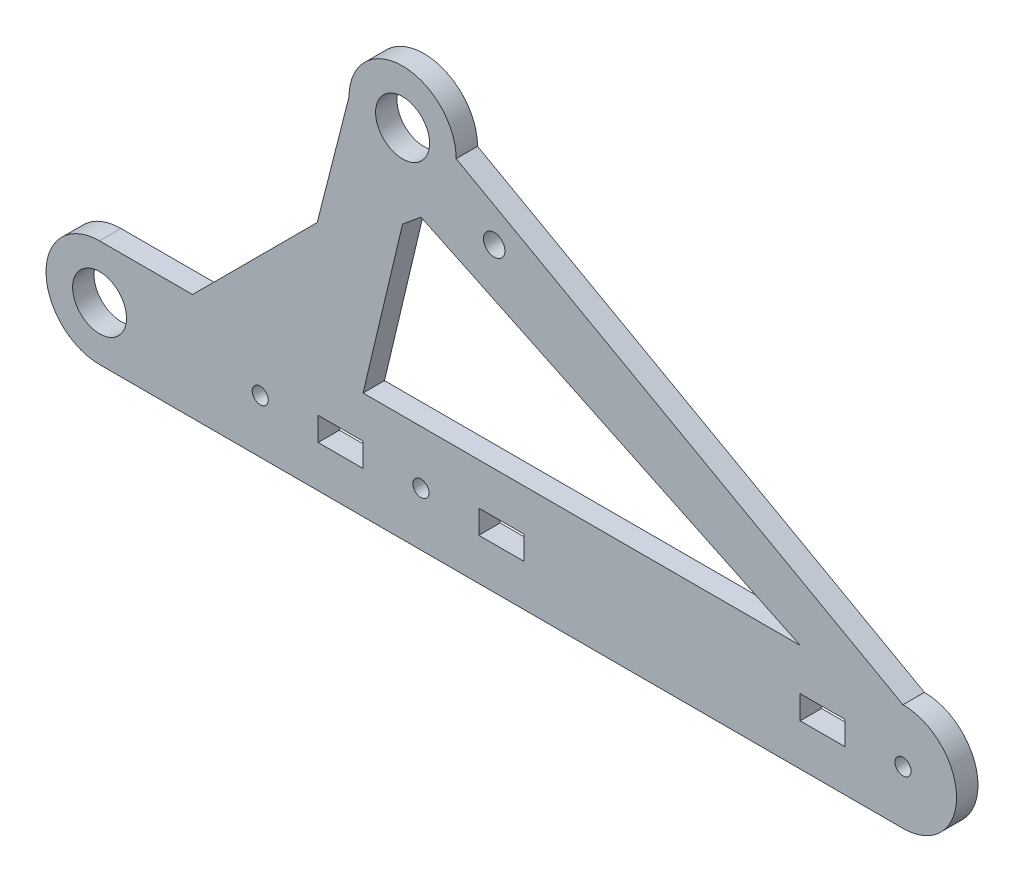
ISO-10303-21;
HEADER;
FILE_DESCRIPTION(('STEP AP214'),'2;1');
FILE_NAME('part.step','',(''),(''),'','','');
FILE_SCHEMA(('AUTOMOTIVE_DESIGN { 1 0 10303 214 1 1 1 1 }'));
ENDSEC;
DATA;
#1=APPLICATION_CONTEXT('core data for automotive mechanical design processes');
#2=APPLICATION_PROTOCOL_DEFINITION('international standard','automotive_design',2000,#1);
#3=PRODUCT_CONTEXT('',#1,'mechanical');
#4=PRODUCT('Part','Part','',(#3));
#5=PRODUCT_RELATED_PRODUCT_CATEGORY('part','',(#4));
#6=PRODUCT_DEFINITION_FORMATION('','',#4);
#7=PRODUCT_DEFINITION_CONTEXT('part definition',#1,'design');
#8=PRODUCT_DEFINITION('design','',#6,#7);
#9=PRODUCT_DEFINITION_SHAPE('','',#8);
#10=(LENGTH_UNIT() NAMED_UNIT(*) SI_UNIT(.MILLI.,.METRE.));
#11=(NAMED_UNIT(*) PLANE_ANGLE_UNIT() SI_UNIT($,.RADIAN.));
#12=(NAMED_UNIT(*) SI_UNIT($,.STERADIAN.) SOLID_ANGLE_UNIT());
#13=UNCERTAINTY_MEASURE_WITH_UNIT(LENGTH_MEASURE(1.E-05),#10,'distance_accuracy_value','');
#14=(GEOMETRIC_REPRESENTATION_CONTEXT(3) GLOBAL_UNCERTAINTY_ASSIGNED_CONTEXT((#13)) GLOBAL_UNIT_ASSIGNED_CONTEXT((#10,
#11,#12)) REPRESENTATION_CONTEXT('',''));
#15=CARTESIAN_POINT('',(0.,0.,0.));
#16=DIRECTION('',(0.,0.,1.));
#17=DIRECTION('',(1.,0.,0.));
#18=AXIS2_PLACEMENT_3D('',#15,#16,#17);
#19=CARTESIAN_POINT('',(150.,0.,4.));
#20=DIRECTION('',(0.,0.,-1.));
#21=DIRECTION('',(-1.,0.,0.));
#22=AXIS2_PLACEMENT_3D('',#19,#20,#21);
#23=PLANE('',#22);
#24=DIRECTION('',(-0.247027018689177,-0.969008592344535,0.));
#25=VECTOR('',#24,1.);
#26=CARTESIAN_POINT('',(34.6966991411009,10.,4.));
#27=LINE('',#26,#25);
#28=CARTESIAN_POINT('',(46.5683051393386,56.5685424949239,4.));
#29=VERTEX_POINT('',#28);
#30=CARTESIAN_POINT('',(40.6325021402197,33.284271247462,4.));
#31=VERTEX_POINT('',#30);
#32=EDGE_CURVE('E293',#29,#31,#27,.T.);
#33=ORIENTED_EDGE('',*,*,#32,.T.);
#34=DIRECTION('',(-0.70710497915049,-0.707108583218013,0.));
#35=VECTOR('',#34,1.);
#36=CARTESIAN_POINT('',(40.6325021402197,33.284271247462,4.));
#37=LINE('',#36,#35);
#38=CARTESIAN_POINT('',(17.3483495705504,10.,4.));
#39=VERTEX_POINT('',#38);
#40=EDGE_CURVE('E55',#31,#39,#37,.T.);
#41=ORIENTED_EDGE('',*,*,#40,.T.);
#42=DIRECTION('',(-1.,0.,0.));
#43=VECTOR('',#42,1.);
#44=CARTESIAN_POINT('',(0.,10.,4.));
#45=LINE('',#44,#43);
#46=CARTESIAN_POINT('',(0.,10.,4.));
#47=VERTEX_POINT('',#46);
#48=EDGE_CURVE('E290',#39,#47,#45,.T.);
#49=ORIENTED_EDGE('',*,*,#48,.T.);
#50=CARTESIAN_POINT('',(0.,0.,4.));
#51=DIRECTION('',(0.,0.,1.));
#52=DIRECTION('',(1.,0.,0.));
#53=AXIS2_PLACEMENT_3D('',#50,#51,#52);
#54=CIRCLE('',#53,10.);
#55=CARTESIAN_POINT('',(0.,-10.,4.));
#56=VERTEX_POINT('',#55);
#57=EDGE_CURVE('E287',#47,#56,#54,.T.);
#58=ORIENTED_EDGE('',*,*,#57,.T.);
#59=DIRECTION('',(1.,0.,0.));
#60=VECTOR('',#59,1.);
#61=CARTESIAN_POINT('',(0.,-10.,4.));
#62=LINE('',#61,#60);
#63=CARTESIAN_POINT('',(150.,-10.,4.));
#64=VERTEX_POINT('',#63);
#65=EDGE_CURVE('E248',#56,#64,#62,.T.);
#66=ORIENTED_EDGE('',*,*,#65,.T.);
#67=CARTESIAN_POINT('',(150.,0.,4.));
#68=DIRECTION('',(0.,0.,1.));
#69=DIRECTION('',(-1.,0.,0.));
#70=AXIS2_PLACEMENT_3D('',#67,#68,#69);
#71=CIRCLE('',#70,10.);
#72=CARTESIAN_POINT('',(150.,10.,4.));
#73=VERTEX_POINT('',#72);
#74=EDGE_CURVE('E242',#64,#73,#71,.T.);
#75=ORIENTED_EDGE('',*,*,#74,.T.);
#76=DIRECTION('',(-0.873187546400361,0.487384354294757,0.));
#77=VECTOR('',#76,1.);
#78=CARTESIAN_POINT('',(66.5687798505088,56.5685424949239,4.));
#79=LINE('',#78,#77);
#80=CARTESIAN_POINT('',(66.5687798505088,56.5685424949239,4.));
#81=VERTEX_POINT('',#80);
#82=EDGE_CURVE('E272',#73,#81,#79,.T.);
#83=ORIENTED_EDGE('',*,*,#82,.T.);
#84=CARTESIAN_POINT('',(56.5685424949237,56.5685424949239,4.));
#85=DIRECTION('',(0.,0.,1.));
#86=DIRECTION('',(-1.,0.,0.));
#87=AXIS2_PLACEMENT_3D('',#84,#85,#86);
#88=CIRCLE('',#87,10.0002373555851);
#89=EDGE_CURVE('E263',#81,#29,#88,.T.);
#90=ORIENTED_EDGE('',*,*,#89,.T.);
#91=EDGE_LOOP('',(#33,#41,#49,#58,#66,#75,#83,#90));
#92=FACE_BOUND('',#91,.T.);
#93=CARTESIAN_POINT('',(73.677090033018,46.2100869567287,4.));
#94=DIRECTION('',(0.,0.,1.));
#95=DIRECTION('',(1.,0.,0.));
#96=AXIS2_PLACEMENT_3D('',#93,#94,#95);
#97=CIRCLE('',#96,2.);
#98=CARTESIAN_POINT('',(75.677090033018,46.2100869567287,4.));
#99=VERTEX_POINT('',#98);
#100=EDGE_CURVE('E455',#99,#99,#97,.T.);
#101=ORIENTED_EDGE('',*,*,#100,.F.);
#102=EDGE_LOOP('',(#101));
#103=FACE_BOUND('',#102,.T.);
#104=DIRECTION('',(0.,1.,0.));
#105=VECTOR('',#104,1.);
#106=CARTESIAN_POINT('',(139.2,2.2,4.));
#107=LINE('',#106,#105);
#108=CARTESIAN_POINT('',(139.2,-2.20000000000001,4.));
#109=VERTEX_POINT('',#108);
#110=CARTESIAN_POINT('',(139.2,2.2,4.));
#111=VERTEX_POINT('',#110);
#112=EDGE_CURVE('E442',#109,#111,#107,.T.);
#113=ORIENTED_EDGE('',*,*,#112,.F.);
#114=DIRECTION('',(1.,0.,0.));
#115=VECTOR('',#114,1.);
#116=CARTESIAN_POINT('',(130.8,-2.20000000000001,4.));
#117=LINE('',#116,#115);
#118=CARTESIAN_POINT('',(130.8,-2.20000000000001,4.));
#119=VERTEX_POINT('',#118);
#120=EDGE_CURVE('E437',#119,#109,#117,.T.);
#121=ORIENTED_EDGE('',*,*,#120,.F.);
#122=DIRECTION('',(0.,-1.,0.));
#123=VECTOR('',#122,1.);
#124=CARTESIAN_POINT('',(130.8,2.2,4.));
#125=LINE('',#124,#123);
#126=CARTESIAN_POINT('',(130.8,2.2,4.));
#127=VERTEX_POINT('',#126);
#128=EDGE_CURVE('E458',#127,#119,#125,.T.);
#129=ORIENTED_EDGE('',*,*,#128,.F.);
#130=DIRECTION('',(-1.,0.,0.));
#131=VECTOR('',#130,1.);
#132=CARTESIAN_POINT('',(130.8,2.2,4.));
#133=LINE('',#132,#131);
#134=EDGE_CURVE('E462',#111,#127,#133,.T.);
#135=ORIENTED_EDGE('',*,*,#134,.F.);
#136=EDGE_LOOP('',(#113,#121,#129,#135));
#137=FACE_BOUND('',#136,.T.);
#138=CARTESIAN_POINT('',(150.,0.,4.));
#139=DIRECTION('',(0.,0.,1.));
#140=DIRECTION('',(1.,0.,0.));
#141=AXIS2_PLACEMENT_3D('',#138,#139,#140);
#142=CIRCLE('',#141,1.5);
#143=CARTESIAN_POINT('',(151.5,0.,4.));
#144=VERTEX_POINT('',#143);
#145=EDGE_CURVE('E345',#144,#144,#142,.T.);
#146=ORIENTED_EDGE('',*,*,#145,.F.);
#147=EDGE_LOOP('',(#146));
#148=FACE_BOUND('',#147,.T.);
#149=DIRECTION('',(-1.,0.,0.));
#150=VECTOR('',#149,1.);
#151=CARTESIAN_POINT('',(79.2,2.19999999999999,4.));
#152=LINE('',#151,#150);
#153=CARTESIAN_POINT('',(79.2,2.19999999999999,4.));
#154=VERTEX_POINT('',#153);
#155=CARTESIAN_POINT('',(70.8,2.19999999999999,4.));
#156=VERTEX_POINT('',#155);
#157=EDGE_CURVE('E332',#154,#156,#152,.T.);
#158=ORIENTED_EDGE('',*,*,#157,.F.);
#159=DIRECTION('',(0.,1.,0.));
#160=VECTOR('',#159,1.);
#161=CARTESIAN_POINT('',(79.2,2.19999999999999,4.));
#162=LINE('',#161,#160);
#163=CARTESIAN_POINT('',(79.2,-2.20000000000001,4.));
#164=VERTEX_POINT('',#163);
#165=EDGE_CURVE('E327',#164,#154,#162,.T.);
#166=ORIENTED_EDGE('',*,*,#165,.F.);
#167=DIRECTION('',(1.,0.,0.));
#168=VECTOR('',#167,1.);
#169=CARTESIAN_POINT('',(79.2,-2.20000000000001,4.));
#170=LINE('',#169,#168);
#171=CARTESIAN_POINT('',(70.8,-2.20000000000001,4.));
#172=VERTEX_POINT('',#171);
#173=EDGE_CURVE('E348',#172,#164,#170,.T.);
#174=ORIENTED_EDGE('',*,*,#173,.F.);
#175=DIRECTION('',(0.,-1.,0.));
#176=VECTOR('',#175,1.);
#177=CARTESIAN_POINT('',(70.8,2.19999999999999,4.));
#178=LINE('',#177,#176);
#179=EDGE_CURVE('E352',#156,#172,#178,.T.);
#180=ORIENTED_EDGE('',*,*,#179,.F.);
#181=EDGE_LOOP('',(#158,#166,#174,#180));
#182=FACE_BOUND('',#181,.T.);
#183=CARTESIAN_POINT('',(0.,0.,4.));
#184=DIRECTION('',(0.,0.,1.));
#185=DIRECTION('',(1.,0.,0.));
#186=AXIS2_PLACEMENT_3D('',#183,#184,#185);
#187=CIRCLE('',#186,5.03);
#188=CARTESIAN_POINT('',(5.03,0.,4.));
#189=VERTEX_POINT('',#188);
#190=EDGE_CURVE('E278',#189,#189,#187,.T.);
#191=ORIENTED_EDGE('',*,*,#190,.F.);
#192=EDGE_LOOP('',(#191));
#193=FACE_BOUND('',#192,.T.);
#194=CARTESIAN_POINT('',(56.5685424949237,56.5685424949239,4.));
#195=DIRECTION('',(0.,0.,1.));
#196=DIRECTION('',(1.,0.,0.));
#197=AXIS2_PLACEMENT_3D('',#194,#195,#196);
#198=CIRCLE('',#197,5.04000000000001);
#199=CARTESIAN_POINT('',(61.6085424949237,56.5685424949239,4.));
#200=VERTEX_POINT('',#199);
#201=EDGE_CURVE('E304',#200,#200,#198,.T.);
#202=ORIENTED_EDGE('',*,*,#201,.F.);
#203=EDGE_LOOP('',(#202));
#204=FACE_BOUND('',#203,.T.);
#205=DIRECTION('',(0.,1.,0.));
#206=VECTOR('',#205,1.);
#207=CARTESIAN_POINT('',(49.2,2.19999999999999,4.));
#208=LINE('',#207,#206);
#209=CARTESIAN_POINT('',(49.2,-2.20000000000001,4.));
#210=VERTEX_POINT('',#209);
#211=CARTESIAN_POINT('',(49.2,2.19999999999999,4.));
#212=VERTEX_POINT('',#211);
#213=EDGE_CURVE('E383',#210,#212,#208,.T.);
#214=ORIENTED_EDGE('',*,*,#213,.F.);
#215=DIRECTION('',(1.,0.,0.));
#216=VECTOR('',#215,1.);
#217=CARTESIAN_POINT('',(40.8,-2.20000000000001,4.));
#218=LINE('',#217,#216);
#219=CARTESIAN_POINT('',(40.8,-2.20000000000001,4.));
#220=VERTEX_POINT('',#219);
#221=EDGE_CURVE('E378',#220,#210,#218,.T.);
#222=ORIENTED_EDGE('',*,*,#221,.F.);
#223=DIRECTION('',(0.,-1.,0.));
#224=VECTOR('',#223,1.);
#225=CARTESIAN_POINT('',(40.8,2.19999999999999,4.));
#226=LINE('',#225,#224);
#227=CARTESIAN_POINT('',(40.8,2.19999999999999,4.));
#228=VERTEX_POINT('',#227);
#229=EDGE_CURVE('E399',#228,#220,#226,.T.);
#230=ORIENTED_EDGE('',*,*,#229,.F.);
#231=DIRECTION('',(-1.,0.,0.));
#232=VECTOR('',#231,1.);
#233=CARTESIAN_POINT('',(40.8,2.19999999999999,4.));
#234=LINE('',#233,#232);
#235=EDGE_CURVE('E403',#212,#228,#234,.T.);
#236=ORIENTED_EDGE('',*,*,#235,.F.);
#237=EDGE_LOOP('',(#214,#222,#230,#236));
#238=FACE_BOUND('',#237,.T.);
#239=CARTESIAN_POINT('',(60.,0.,4.));
#240=DIRECTION('',(0.,0.,1.));
#241=DIRECTION('',(1.,0.,0.));
#242=AXIS2_PLACEMENT_3D('',#239,#240,#241);
#243=CIRCLE('',#242,1.5);
#244=CARTESIAN_POINT('',(61.5,0.,4.));
#245=VERTEX_POINT('',#244);
#246=EDGE_CURVE('E396',#245,#245,#243,.T.);
#247=ORIENTED_EDGE('',*,*,#246,.F.);
#248=EDGE_LOOP('',(#247));
#249=FACE_BOUND('',#248,.T.);
#250=CARTESIAN_POINT('',(30.,0.,4.));
#251=DIRECTION('',(0.,0.,1.));
#252=DIRECTION('',(1.,0.,0.));
#253=AXIS2_PLACEMENT_3D('',#250,#251,#252);
#254=CIRCLE('',#253,1.5);
#255=CARTESIAN_POINT('',(31.5,0.,4.));
#256=VERTEX_POINT('',#255);
#257=EDGE_CURVE('E412',#256,#256,#254,.T.);
#258=ORIENTED_EDGE('',*,*,#257,.F.);
#259=EDGE_LOOP('',(#258));
#260=FACE_BOUND('',#259,.T.);
#261=DIRECTION('',(-0.769100279838974,-0.639128124519343,0.));
#262=VECTOR('',#261,1.);
#263=CARTESIAN_POINT('',(60.,43.8441514122966,4.));
#264=LINE('',#263,#262);
#265=CARTESIAN_POINT('',(60.,43.8441514122966,4.));
#266=VERTEX_POINT('',#265);
#267=CARTESIAN_POINT('',(56.5685424949237,40.9925843838118,4.));
#268=VERTEX_POINT('',#267);
#269=EDGE_CURVE('E492',#266,#268,#264,.T.);
#270=ORIENTED_EDGE('',*,*,#269,.F.);
#271=DIRECTION('',(-0.902217127642244,0.431282105574737,0.));
#272=VECTOR('',#271,1.);
#273=CARTESIAN_POINT('',(130.8,10.,4.));
#274=LINE('',#273,#272);
#275=CARTESIAN_POINT('',(130.8,10.,4.));
#276=VERTEX_POINT('',#275);
#277=EDGE_CURVE('E487',#276,#266,#274,.T.);
#278=ORIENTED_EDGE('',*,*,#277,.F.);
#279=DIRECTION('',(1.,0.,0.));
#280=VECTOR('',#279,1.);
#281=CARTESIAN_POINT('',(49.2,10.,4.));
#282=LINE('',#281,#280);
#283=CARTESIAN_POINT('',(49.2,10.,4.));
#284=VERTEX_POINT('',#283);
#285=EDGE_CURVE('E507',#284,#276,#282,.T.);
#286=ORIENTED_EDGE('',*,*,#285,.F.);
#287=DIRECTION('',(-0.231304308852605,-0.972881450489328,0.));
#288=VECTOR('',#287,1.);
#289=CARTESIAN_POINT('',(56.5685424949237,40.9925843838118,4.));
#290=LINE('',#289,#288);
#291=EDGE_CURVE('E510',#268,#284,#290,.T.);
#292=ORIENTED_EDGE('',*,*,#291,.F.);
#293=EDGE_LOOP('',(#270,#278,#286,#292));
#294=FACE_BOUND('',#293,.T.);
#295=ADVANCED_FACE('F39',(#92,#103,#137,#148,#182,#193,#204,#238,#249,#260,#294),#23,.F.);
#296=CARTESIAN_POINT('',(150.,0.,0.));
#297=DIRECTION('',(0.,0.,-1.));
#298=DIRECTION('',(-1.,0.,0.));
#299=AXIS2_PLACEMENT_3D('',#296,#297,#298);
#300=PLANE('',#299);
#301=DIRECTION('',(-0.70710497915049,-0.707108583218013,0.));
#302=VECTOR('',#301,1.);
#303=CARTESIAN_POINT('',(40.6325021402197,33.284271247462,0.));
#304=LINE('',#303,#302);
#305=CARTESIAN_POINT('',(40.6325021402197,33.284271247462,0.));
#306=VERTEX_POINT('',#305);
#307=CARTESIAN_POINT('',(17.3483495705504,10.,0.));
#308=VERTEX_POINT('',#307);
#309=EDGE_CURVE('E203',#306,#308,#304,.T.);
#310=ORIENTED_EDGE('',*,*,#309,.F.);
#311=DIRECTION('',(-0.247027018689177,-0.969008592344535,0.));
#312=VECTOR('',#311,1.);
#313=CARTESIAN_POINT('',(34.6966991411009,10.,0.));
#314=LINE('',#313,#312);
#315=CARTESIAN_POINT('',(46.5683051393386,56.5685424949239,0.));
#316=VERTEX_POINT('',#315);
#317=EDGE_CURVE('E217',#316,#306,#314,.T.);
#318=ORIENTED_EDGE('',*,*,#317,.F.);
#319=CARTESIAN_POINT('',(56.5685424949237,56.5685424949239,0.));
#320=DIRECTION('',(0.,0.,1.));
#321=DIRECTION('',(-1.,0.,0.));
#322=AXIS2_PLACEMENT_3D('',#319,#320,#321);
#323=CIRCLE('',#322,10.0002373555851);
#324=CARTESIAN_POINT('',(66.5687798505088,56.5685424949239,0.));
#325=VERTEX_POINT('',#324);
#326=EDGE_CURVE('E227',#325,#316,#323,.T.);
#327=ORIENTED_EDGE('',*,*,#326,.F.);
#328=DIRECTION('',(-0.873187546400361,0.487384354294757,0.));
#329=VECTOR('',#328,1.);
#330=CARTESIAN_POINT('',(66.5687798505088,56.5685424949239,0.));
#331=LINE('',#330,#329);
#332=CARTESIAN_POINT('',(150.,10.,0.));
#333=VERTEX_POINT('',#332);
#334=EDGE_CURVE('E233',#333,#325,#331,.T.);
#335=ORIENTED_EDGE('',*,*,#334,.F.);
#336=CARTESIAN_POINT('',(150.,0.,0.));
#337=DIRECTION('',(0.,0.,1.));
#338=DIRECTION('',(-1.,0.,0.));
#339=AXIS2_PLACEMENT_3D('',#336,#337,#338);
#340=CIRCLE('',#339,10.);
#341=CARTESIAN_POINT('',(150.,-10.,0.));
#342=VERTEX_POINT('',#341);
#343=EDGE_CURVE('E268',#342,#333,#340,.T.);
#344=ORIENTED_EDGE('',*,*,#343,.F.);
#345=DIRECTION('',(1.,0.,0.));
#346=VECTOR('',#345,1.);
#347=CARTESIAN_POINT('',(0.,-10.,0.));
#348=LINE('',#347,#346);
#349=CARTESIAN_POINT('',(0.,-10.,0.));
#350=VERTEX_POINT('',#349);
#351=EDGE_CURVE('E239',#350,#342,#348,.T.);
#352=ORIENTED_EDGE('',*,*,#351,.F.);
#353=CARTESIAN_POINT('',(0.,0.,0.));
#354=DIRECTION('',(0.,0.,1.));
#355=DIRECTION('',(1.,0.,0.));
#356=AXIS2_PLACEMENT_3D('',#353,#354,#355);
#357=CIRCLE('',#356,10.);
#358=CARTESIAN_POINT('',(0.,10.,0.));
#359=VERTEX_POINT('',#358);
#360=EDGE_CURVE('E231',#359,#350,#357,.T.);
#361=ORIENTED_EDGE('',*,*,#360,.F.);
#362=DIRECTION('',(-1.,0.,0.));
#363=VECTOR('',#362,1.);
#364=CARTESIAN_POINT('',(0.,10.,0.));
#365=LINE('',#364,#363);
#366=EDGE_CURVE('E219',#308,#359,#365,.T.);
#367=ORIENTED_EDGE('',*,*,#366,.F.);
#368=EDGE_LOOP('',(#310,#318,#327,#335,#344,#352,#361,#367));
#369=FACE_BOUND('',#368,.T.);
#370=DIRECTION('',(1.,0.,0.));
#371=VECTOR('',#370,1.);
#372=CARTESIAN_POINT('',(130.8,-2.20000000000001,0.));
#373=LINE('',#372,#371);
#374=CARTESIAN_POINT('',(130.8,-2.20000000000001,0.));
#375=VERTEX_POINT('',#374);
#376=CARTESIAN_POINT('',(139.2,-2.20000000000001,0.));
#377=VERTEX_POINT('',#376);
#378=EDGE_CURVE('E438',#375,#377,#373,.T.);
#379=ORIENTED_EDGE('',*,*,#378,.T.);
#380=DIRECTION('',(0.,1.,0.));
#381=VECTOR('',#380,1.);
#382=CARTESIAN_POINT('',(139.2,2.2,0.));
#383=LINE('',#382,#381);
#384=CARTESIAN_POINT('',(139.2,2.2,0.));
#385=VERTEX_POINT('',#384);
#386=EDGE_CURVE('E451',#377,#385,#383,.T.);
#387=ORIENTED_EDGE('',*,*,#386,.T.);
#388=DIRECTION('',(-1.,0.,0.));
#389=VECTOR('',#388,1.);
#390=CARTESIAN_POINT('',(130.8,2.2,0.));
#391=LINE('',#390,#389);
#392=CARTESIAN_POINT('',(130.8,2.2,0.));
#393=VERTEX_POINT('',#392);
#394=EDGE_CURVE('E447',#385,#393,#391,.T.);
#395=ORIENTED_EDGE('',*,*,#394,.T.);
#396=DIRECTION('',(0.,-1.,0.));
#397=VECTOR('',#396,1.);
#398=CARTESIAN_POINT('',(130.8,2.2,0.));
#399=LINE('',#398,#397);
#400=EDGE_CURVE('E443',#393,#375,#399,.T.);
#401=ORIENTED_EDGE('',*,*,#400,.T.);
#402=EDGE_LOOP('',(#379,#387,#395,#401));
#403=FACE_BOUND('',#402,.T.);
#404=CARTESIAN_POINT('',(30.,0.,0.));
#405=DIRECTION('',(0.,0.,1.));
#406=DIRECTION('',(1.,0.,0.));
#407=AXIS2_PLACEMENT_3D('',#404,#405,#406);
#408=CIRCLE('',#407,1.5);
#409=CARTESIAN_POINT('',(31.5,0.,0.));
#410=VERTEX_POINT('',#409);
#411=EDGE_CURVE('E416',#410,#410,#408,.T.);
#412=ORIENTED_EDGE('',*,*,#411,.T.);
#413=EDGE_LOOP('',(#412));
#414=FACE_BOUND('',#413,.T.);
#415=DIRECTION('',(1.,0.,0.));
#416=VECTOR('',#415,1.);
#417=CARTESIAN_POINT('',(40.8,-2.20000000000001,0.));
#418=LINE('',#417,#416);
#419=CARTESIAN_POINT('',(40.8,-2.20000000000001,0.));
#420=VERTEX_POINT('',#419);
#421=CARTESIAN_POINT('',(49.2,-2.20000000000001,0.));
#422=VERTEX_POINT('',#421);
#423=EDGE_CURVE('E379',#420,#422,#418,.T.);
#424=ORIENTED_EDGE('',*,*,#423,.T.);
#425=DIRECTION('',(0.,1.,0.));
#426=VECTOR('',#425,1.);
#427=CARTESIAN_POINT('',(49.2,2.19999999999999,0.));
#428=LINE('',#427,#426);
#429=CARTESIAN_POINT('',(49.2,2.19999999999999,0.));
#430=VERTEX_POINT('',#429);
#431=EDGE_CURVE('E392',#422,#430,#428,.T.);
#432=ORIENTED_EDGE('',*,*,#431,.T.);
#433=DIRECTION('',(-1.,0.,0.));
#434=VECTOR('',#433,1.);
#435=CARTESIAN_POINT('',(40.8,2.19999999999999,0.));
#436=LINE('',#435,#434);
#437=CARTESIAN_POINT('',(40.8,2.19999999999999,0.));
#438=VERTEX_POINT('',#437);
#439=EDGE_CURVE('E388',#430,#438,#436,.T.);
#440=ORIENTED_EDGE('',*,*,#439,.T.);
#441=DIRECTION('',(0.,-1.,0.));
#442=VECTOR('',#441,1.);
#443=CARTESIAN_POINT('',(40.8,2.19999999999999,0.));
#444=LINE('',#443,#442);
#445=EDGE_CURVE('E384',#438,#420,#444,.T.);
#446=ORIENTED_EDGE('',*,*,#445,.T.);
#447=EDGE_LOOP('',(#424,#432,#440,#446));
#448=FACE_BOUND('',#447,.T.);
#449=CARTESIAN_POINT('',(150.,0.,0.));
#450=DIRECTION('',(0.,0.,1.));
#451=DIRECTION('',(1.,0.,0.));
#452=AXIS2_PLACEMENT_3D('',#449,#450,#451);
#453=CIRCLE('',#452,1.5);
#454=CARTESIAN_POINT('',(151.5,0.,0.));
#455=VERTEX_POINT('',#454);
#456=EDGE_CURVE('E357',#455,#455,#453,.T.);
#457=ORIENTED_EDGE('',*,*,#456,.T.);
#458=EDGE_LOOP('',(#457));
#459=FACE_BOUND('',#458,.T.);
#460=CARTESIAN_POINT('',(0.,0.,0.));
#461=DIRECTION('',(0.,0.,1.));
#462=DIRECTION('',(1.,0.,0.));
#463=AXIS2_PLACEMENT_3D('',#460,#461,#462);
#464=CIRCLE('',#463,5.03);
#465=CARTESIAN_POINT('',(5.03,0.,0.));
#466=VERTEX_POINT('',#465);
#467=EDGE_CURVE('E282',#466,#466,#464,.T.);
#468=ORIENTED_EDGE('',*,*,#467,.T.);
#469=EDGE_LOOP('',(#468));
#470=FACE_BOUND('',#469,.T.);
#471=CARTESIAN_POINT('',(56.5685424949237,56.5685424949239,0.));
#472=DIRECTION('',(0.,0.,1.));
#473=DIRECTION('',(1.,0.,0.));
#474=AXIS2_PLACEMENT_3D('',#471,#472,#473);
#475=CIRCLE('',#474,5.04000000000001);
#476=CARTESIAN_POINT('',(61.6085424949237,56.5685424949239,0.));
#477=VERTEX_POINT('',#476);
#478=EDGE_CURVE('E306',#477,#477,#475,.T.);
#479=ORIENTED_EDGE('',*,*,#478,.T.);
#480=EDGE_LOOP('',(#479));
#481=FACE_BOUND('',#480,.T.);
#482=DIRECTION('',(0.,1.,0.));
#483=VECTOR('',#482,1.);
#484=CARTESIAN_POINT('',(79.2,2.19999999999999,0.));
#485=LINE('',#484,#483);
#486=CARTESIAN_POINT('',(79.2,-2.20000000000001,0.));
#487=VERTEX_POINT('',#486);
#488=CARTESIAN_POINT('',(79.2,2.19999999999999,0.));
#489=VERTEX_POINT('',#488);
#490=EDGE_CURVE('E328',#487,#489,#485,.T.);
#491=ORIENTED_EDGE('',*,*,#490,.T.);
#492=DIRECTION('',(-1.,0.,0.));
#493=VECTOR('',#492,1.);
#494=CARTESIAN_POINT('',(79.2,2.19999999999999,0.));
#495=LINE('',#494,#493);
#496=CARTESIAN_POINT('',(70.8,2.19999999999999,0.));
#497=VERTEX_POINT('',#496);
#498=EDGE_CURVE('E341',#489,#497,#495,.T.);
#499=ORIENTED_EDGE('',*,*,#498,.T.);
#500=DIRECTION('',(0.,-1.,0.));
#501=VECTOR('',#500,1.);
#502=CARTESIAN_POINT('',(70.8,2.19999999999999,0.));
#503=LINE('',#502,#501);
#504=CARTESIAN_POINT('',(70.8,-2.20000000000001,0.));
#505=VERTEX_POINT('',#504);
#506=EDGE_CURVE('E337',#497,#505,#503,.T.);
#507=ORIENTED_EDGE('',*,*,#506,.T.);
#508=DIRECTION('',(1.,0.,0.));
#509=VECTOR('',#508,1.);
#510=CARTESIAN_POINT('',(79.2,-2.20000000000001,0.));
#511=LINE('',#510,#509);
#512=EDGE_CURVE('E333',#505,#487,#511,.T.);
#513=ORIENTED_EDGE('',*,*,#512,.T.);
#514=EDGE_LOOP('',(#491,#499,#507,#513));
#515=FACE_BOUND('',#514,.T.);
#516=CARTESIAN_POINT('',(60.,0.,0.));
#517=DIRECTION('',(0.,0.,1.));
#518=DIRECTION('',(1.,0.,0.));
#519=AXIS2_PLACEMENT_3D('',#516,#517,#518);
#520=CIRCLE('',#519,1.5);
#521=CARTESIAN_POINT('',(61.5,0.,0.));
#522=VERTEX_POINT('',#521);
#523=EDGE_CURVE('E408',#522,#522,#520,.T.);
#524=ORIENTED_EDGE('',*,*,#523,.T.);
#525=EDGE_LOOP('',(#524));
#526=FACE_BOUND('',#525,.T.);
#527=CARTESIAN_POINT('',(73.677090033018,46.2100869567287,0.));
#528=DIRECTION('',(0.,0.,1.));
#529=DIRECTION('',(1.,0.,0.));
#530=AXIS2_PLACEMENT_3D('',#527,#528,#529);
#531=CIRCLE('',#530,2.);
#532=CARTESIAN_POINT('',(75.677090033018,46.2100869567287,0.));
#533=VERTEX_POINT('',#532);
#534=EDGE_CURVE('E467',#533,#533,#531,.T.);
#535=ORIENTED_EDGE('',*,*,#534,.T.);
#536=EDGE_LOOP('',(#535));
#537=FACE_BOUND('',#536,.T.);
#538=DIRECTION('',(-0.902217127642244,0.431282105574737,0.));
#539=VECTOR('',#538,1.);
#540=CARTESIAN_POINT('',(130.8,10.,0.));
#541=LINE('',#540,#539);
#542=CARTESIAN_POINT('',(130.8,10.,0.));
#543=VERTEX_POINT('',#542);
#544=CARTESIAN_POINT('',(60.,43.8441514122966,0.));
#545=VERTEX_POINT('',#544);
#546=EDGE_CURVE('E488',#543,#545,#541,.T.);
#547=ORIENTED_EDGE('',*,*,#546,.T.);
#548=DIRECTION('',(-0.769100279838974,-0.639128124519343,0.));
#549=VECTOR('',#548,1.);
#550=CARTESIAN_POINT('',(60.,43.8441514122966,0.));
#551=LINE('',#550,#549);
#552=CARTESIAN_POINT('',(56.5685424949237,40.9925843838118,0.));
#553=VERTEX_POINT('',#552);
#554=EDGE_CURVE('E501',#545,#553,#551,.T.);
#555=ORIENTED_EDGE('',*,*,#554,.T.);
#556=DIRECTION('',(-0.231304308852605,-0.972881450489328,0.));
#557=VECTOR('',#556,1.);
#558=CARTESIAN_POINT('',(56.5685424949237,40.9925843838118,0.));
#559=LINE('',#558,#557);
#560=CARTESIAN_POINT('',(49.2,10.,0.));
#561=VERTEX_POINT('',#560);
#562=EDGE_CURVE('E497',#553,#561,#559,.T.);
#563=ORIENTED_EDGE('',*,*,#562,.T.);
#564=DIRECTION('',(1.,0.,0.));
#565=VECTOR('',#564,1.);
#566=CARTESIAN_POINT('',(49.2,10.,0.));
#567=LINE('',#566,#565);
#568=EDGE_CURVE('E493',#561,#543,#567,.T.);
#569=ORIENTED_EDGE('',*,*,#568,.T.);
#570=EDGE_LOOP('',(#547,#555,#563,#569));
#571=FACE_BOUND('',#570,.T.);
#572=ADVANCED_FACE('F214',(#369,#403,#414,#448,#459,#470,#481,#515,#526,#537,#571),#300,.T.);
#573=CARTESIAN_POINT('',(150.,0.,4.));
#574=DIRECTION('',(0.,0.,-1.));
#575=DIRECTION('',(-1.,0.,0.));
#576=AXIS2_PLACEMENT_3D('',#573,#574,#575);
#577=CYLINDRICAL_SURFACE('',#576,10.);
#578=ORIENTED_EDGE('',*,*,#343,.T.);
#579=DIRECTION('',(0.,0.,-1.));
#580=VECTOR('',#579,1.);
#581=CARTESIAN_POINT('',(150.,10.,4.));
#582=LINE('',#581,#580);
#583=EDGE_CURVE('E11',#73,#333,#582,.T.);
#584=ORIENTED_EDGE('',*,*,#583,.F.);
#585=ORIENTED_EDGE('',*,*,#74,.F.);
#586=DIRECTION('',(0.,0.,-1.));
#587=VECTOR('',#586,1.);
#588=CARTESIAN_POINT('',(150.,-10.,4.));
#589=LINE('',#588,#587);
#590=EDGE_CURVE('E243',#64,#342,#589,.T.);
#591=ORIENTED_EDGE('',*,*,#590,.T.);
#592=EDGE_LOOP('',(#578,#584,#585,#591));
#593=FACE_BOUND('',#592,.T.);
#594=ADVANCED_FACE('F41',(#593),#577,.T.);
#595=CARTESIAN_POINT('',(66.5687798505088,56.5685424949239,4.));
#596=DIRECTION('',(-0.487384354294757,-0.873187546400361,0.));
#597=DIRECTION('',(0.873187546400361,-0.487384354294757,0.));
#598=AXIS2_PLACEMENT_3D('',#595,#596,#597);
#599=PLANE('',#598);
#600=ORIENTED_EDGE('',*,*,#334,.T.);
#601=DIRECTION('',(0.,0.,-1.));
#602=VECTOR('',#601,1.);
#603=CARTESIAN_POINT('',(66.5687798505088,56.5685424949239,4.));
#604=LINE('',#603,#602);
#605=EDGE_CURVE('E48',#81,#325,#604,.T.);
#606=ORIENTED_EDGE('',*,*,#605,.F.);
#607=ORIENTED_EDGE('',*,*,#82,.F.);
#608=ORIENTED_EDGE('',*,*,#583,.T.);
#609=EDGE_LOOP('',(#600,#606,#607,#608));
#610=FACE_BOUND('',#609,.T.);
#611=ADVANCED_FACE('F271',(#610),#599,.F.);
#612=CARTESIAN_POINT('',(56.5685424949237,56.5685424949239,4.));
#613=DIRECTION('',(0.,0.,-1.));
#614=DIRECTION('',(-1.,0.,0.));
#615=AXIS2_PLACEMENT_3D('',#612,#613,#614);
#616=CYLINDRICAL_SURFACE('',#615,10.0002373555851);
#617=ORIENTED_EDGE('',*,*,#326,.T.);
#618=DIRECTION('',(0.,0.,-1.));
#619=VECTOR('',#618,1.);
#620=CARTESIAN_POINT('',(46.5683051393386,56.5685424949239,4.));
#621=LINE('',#620,#619);
#622=EDGE_CURVE('E225',#29,#316,#621,.T.);
#623=ORIENTED_EDGE('',*,*,#622,.F.);
#624=ORIENTED_EDGE('',*,*,#89,.F.);
#625=ORIENTED_EDGE('',*,*,#605,.T.);
#626=EDGE_LOOP('',(#617,#623,#624,#625));
#627=FACE_BOUND('',#626,.T.);
#628=ADVANCED_FACE('F262',(#627),#616,.T.);
#629=CARTESIAN_POINT('',(34.6966991411009,10.,4.));
#630=DIRECTION('',(0.969008592344535,-0.247027018689177,0.));
#631=DIRECTION('',(0.247027018689177,0.969008592344535,0.));
#632=AXIS2_PLACEMENT_3D('',#629,#630,#631);
#633=PLANE('',#632);
#634=ORIENTED_EDGE('',*,*,#317,.T.);
#635=DIRECTION('',(0.,0.,1.));
#636=VECTOR('',#635,1.);
#637=CARTESIAN_POINT('',(40.6325021402197,33.284271247462,0.));
#638=LINE('',#637,#636);
#639=EDGE_CURVE('E200',#306,#31,#638,.T.);
#640=ORIENTED_EDGE('',*,*,#639,.T.);
#641=ORIENTED_EDGE('',*,*,#32,.F.);
#642=ORIENTED_EDGE('',*,*,#622,.T.);
#643=EDGE_LOOP('',(#634,#640,#641,#642));
#644=FACE_BOUND('',#643,.T.);
#645=ADVANCED_FACE('F223',(#644),#633,.F.);
#646=CARTESIAN_POINT('',(0.,10.,4.));
#647=DIRECTION('',(0.,-1.,0.));
#648=DIRECTION('',(1.,0.,0.));
#649=AXIS2_PLACEMENT_3D('',#646,#647,#648);
#650=PLANE('',#649);
#651=ORIENTED_EDGE('',*,*,#48,.F.);
#652=DIRECTION('',(0.,0.,1.));
#653=VECTOR('',#652,1.);
#654=CARTESIAN_POINT('',(17.3483495705504,10.,0.));
#655=LINE('',#654,#653);
#656=EDGE_CURVE('E209',#308,#39,#655,.T.);
#657=ORIENTED_EDGE('',*,*,#656,.F.);
#658=ORIENTED_EDGE('',*,*,#366,.T.);
#659=DIRECTION('',(0.,0.,-1.));
#660=VECTOR('',#659,1.);
#661=CARTESIAN_POINT('',(0.,10.,4.));
#662=LINE('',#661,#660);
#663=EDGE_CURVE('E252',#47,#359,#662,.T.);
#664=ORIENTED_EDGE('',*,*,#663,.F.);
#665=EDGE_LOOP('',(#651,#657,#658,#664));
#666=FACE_BOUND('',#665,.T.);
#667=ADVANCED_FACE('F521',(#666),#650,.F.);
#668=CARTESIAN_POINT('',(0.,0.,4.));
#669=DIRECTION('',(0.,0.,-1.));
#670=DIRECTION('',(-1.,0.,0.));
#671=AXIS2_PLACEMENT_3D('',#668,#669,#670);
#672=CYLINDRICAL_SURFACE('',#671,10.);
#673=ORIENTED_EDGE('',*,*,#360,.T.);
#674=DIRECTION('',(0.,0.,-1.));
#675=VECTOR('',#674,1.);
#676=CARTESIAN_POINT('',(0.,-10.,4.));
#677=LINE('',#676,#675);
#678=EDGE_CURVE('E247',#56,#350,#677,.T.);
#679=ORIENTED_EDGE('',*,*,#678,.F.);
#680=ORIENTED_EDGE('',*,*,#57,.F.);
#681=ORIENTED_EDGE('',*,*,#663,.T.);
#682=EDGE_LOOP('',(#673,#679,#680,#681));
#683=FACE_BOUND('',#682,.T.);
#684=ADVANCED_FACE('F527',(#683),#672,.T.);
#685=CARTESIAN_POINT('',(0.,-10.,4.));
#686=DIRECTION('',(0.,1.,0.));
#687=DIRECTION('',(-1.,0.,0.));
#688=AXIS2_PLACEMENT_3D('',#685,#686,#687);
#689=PLANE('',#688);
#690=ORIENTED_EDGE('',*,*,#351,.T.);
#691=ORIENTED_EDGE('',*,*,#590,.F.);
#692=ORIENTED_EDGE('',*,*,#65,.F.);
#693=ORIENTED_EDGE('',*,*,#678,.T.);
#694=EDGE_LOOP('',(#690,#691,#692,#693));
#695=FACE_BOUND('',#694,.T.);
#696=ADVANCED_FACE('F529',(#695),#689,.F.);
#697=CARTESIAN_POINT('',(0.,0.,4.));
#698=DIRECTION('',(0.,0.,-1.));
#699=DIRECTION('',(-1.,0.,0.));
#700=AXIS2_PLACEMENT_3D('',#697,#698,#699);
#701=CYLINDRICAL_SURFACE('',#700,5.03);
#702=ORIENTED_EDGE('',*,*,#190,.T.);
#703=EDGE_LOOP('',(#702));
#704=FACE_BOUND('',#703,.T.);
#705=ORIENTED_EDGE('',*,*,#467,.F.);
#706=EDGE_LOOP('',(#705));
#707=FACE_BOUND('',#706,.T.);
#708=ADVANCED_FACE('F531',(#704,#707),#701,.F.);
#709=CARTESIAN_POINT('',(56.5685424949237,56.5685424949239,4.));
#710=DIRECTION('',(0.,0.,-1.));
#711=DIRECTION('',(-1.,0.,0.));
#712=AXIS2_PLACEMENT_3D('',#709,#710,#711);
#713=CYLINDRICAL_SURFACE('',#712,5.04000000000001);
#714=ORIENTED_EDGE('',*,*,#201,.T.);
#715=EDGE_LOOP('',(#714));
#716=FACE_BOUND('',#715,.T.);
#717=ORIENTED_EDGE('',*,*,#478,.F.);
#718=EDGE_LOOP('',(#717));
#719=FACE_BOUND('',#718,.T.);
#720=ADVANCED_FACE('F537',(#716,#719),#713,.F.);
#721=CARTESIAN_POINT('',(79.2,2.19999999999999,4.));
#722=DIRECTION('',(0.,-1.,0.));
#723=DIRECTION('',(0.,0.,-1.));
#724=AXIS2_PLACEMENT_3D('',#721,#722,#723);
#725=PLANE('',#724);
#726=ORIENTED_EDGE('',*,*,#498,.F.);
#727=DIRECTION('',(0.,0.,-1.));
#728=VECTOR('',#727,1.);
#729=CARTESIAN_POINT('',(79.2,2.19999999999999,4.));
#730=LINE('',#729,#728);
#731=EDGE_CURVE('E323',#154,#489,#730,.T.);
#732=ORIENTED_EDGE('',*,*,#731,.F.);
#733=ORIENTED_EDGE('',*,*,#157,.T.);
#734=DIRECTION('',(0.,0.,-1.));
#735=VECTOR('',#734,1.);
#736=CARTESIAN_POINT('',(70.8,2.19999999999999,4.));
#737=LINE('',#736,#735);
#738=EDGE_CURVE('E310',#156,#497,#737,.T.);
#739=ORIENTED_EDGE('',*,*,#738,.T.);
#740=EDGE_LOOP('',(#726,#732,#733,#739));
#741=FACE_BOUND('',#740,.T.);
#742=ADVANCED_FACE('F550',(#741),#725,.T.);
#743=CARTESIAN_POINT('',(70.8,2.19999999999999,4.));
#744=DIRECTION('',(1.,0.,0.));
#745=DIRECTION('',(0.,0.,-1.));
#746=AXIS2_PLACEMENT_3D('',#743,#744,#745);
#747=PLANE('',#746);
#748=ORIENTED_EDGE('',*,*,#506,.F.);
#749=ORIENTED_EDGE('',*,*,#738,.F.);
#750=ORIENTED_EDGE('',*,*,#179,.T.);
#751=DIRECTION('',(0.,0.,-1.));
#752=VECTOR('',#751,1.);
#753=CARTESIAN_POINT('',(70.8,-2.20000000000001,4.));
#754=LINE('',#753,#752);
#755=EDGE_CURVE('E317',#172,#505,#754,.T.);
#756=ORIENTED_EDGE('',*,*,#755,.T.);
#757=EDGE_LOOP('',(#748,#749,#750,#756));
#758=FACE_BOUND('',#757,.T.);
#759=ADVANCED_FACE('F554',(#758),#747,.T.);
#760=CARTESIAN_POINT('',(79.2,-2.20000000000001,4.));
#761=DIRECTION('',(0.,1.,0.));
#762=DIRECTION('',(0.,0.,1.));
#763=AXIS2_PLACEMENT_3D('',#760,#761,#762);
#764=PLANE('',#763);
#765=ORIENTED_EDGE('',*,*,#512,.F.);
#766=ORIENTED_EDGE('',*,*,#755,.F.);
#767=ORIENTED_EDGE('',*,*,#173,.T.);
#768=DIRECTION('',(0.,0.,-1.));
#769=VECTOR('',#768,1.);
#770=CARTESIAN_POINT('',(79.2,-2.20000000000001,4.));
#771=LINE('',#770,#769);
#772=EDGE_CURVE('E320',#164,#487,#771,.T.);
#773=ORIENTED_EDGE('',*,*,#772,.T.);
#774=EDGE_LOOP('',(#765,#766,#767,#773));
#775=FACE_BOUND('',#774,.T.);
#776=ADVANCED_FACE('F558',(#775),#764,.T.);
#777=CARTESIAN_POINT('',(79.2,2.19999999999999,4.));
#778=DIRECTION('',(-1.,0.,0.));
#779=DIRECTION('',(0.,0.,1.));
#780=AXIS2_PLACEMENT_3D('',#777,#778,#779);
#781=PLANE('',#780);
#782=ORIENTED_EDGE('',*,*,#490,.F.);
#783=ORIENTED_EDGE('',*,*,#772,.F.);
#784=ORIENTED_EDGE('',*,*,#165,.T.);
#785=ORIENTED_EDGE('',*,*,#731,.T.);
#786=EDGE_LOOP('',(#782,#783,#784,#785));
#787=FACE_BOUND('',#786,.T.);
#788=ADVANCED_FACE('F562',(#787),#781,.T.);
#789=CARTESIAN_POINT('',(150.,0.,4.));
#790=DIRECTION('',(0.,0.,-1.));
#791=DIRECTION('',(-1.,0.,0.));
#792=AXIS2_PLACEMENT_3D('',#789,#790,#791);
#793=CYLINDRICAL_SURFACE('',#792,1.5);
#794=ORIENTED_EDGE('',*,*,#145,.T.);
#795=EDGE_LOOP('',(#794));
#796=FACE_BOUND('',#795,.T.);
#797=ORIENTED_EDGE('',*,*,#456,.F.);
#798=EDGE_LOOP('',(#797));
#799=FACE_BOUND('',#798,.T.);
#800=ADVANCED_FACE('F566',(#796,#799),#793,.F.);
#801=CARTESIAN_POINT('',(49.2,2.19999999999999,4.));
#802=DIRECTION('',(-1.,0.,0.));
#803=DIRECTION('',(0.,0.,1.));
#804=AXIS2_PLACEMENT_3D('',#801,#802,#803);
#805=PLANE('',#804);
#806=ORIENTED_EDGE('',*,*,#431,.F.);
#807=DIRECTION('',(0.,0.,-1.));
#808=VECTOR('',#807,1.);
#809=CARTESIAN_POINT('',(49.2,-2.20000000000001,4.));
#810=LINE('',#809,#808);
#811=EDGE_CURVE('E374',#210,#422,#810,.T.);
#812=ORIENTED_EDGE('',*,*,#811,.F.);
#813=ORIENTED_EDGE('',*,*,#213,.T.);
#814=DIRECTION('',(0.,0.,-1.));
#815=VECTOR('',#814,1.);
#816=CARTESIAN_POINT('',(49.2,2.19999999999999,4.));
#817=LINE('',#816,#815);
#818=EDGE_CURVE('E361',#212,#430,#817,.T.);
#819=ORIENTED_EDGE('',*,*,#818,.T.);
#820=EDGE_LOOP('',(#806,#812,#813,#819));
#821=FACE_BOUND('',#820,.T.);
#822=ADVANCED_FACE('F570',(#821),#805,.T.);
#823=CARTESIAN_POINT('',(40.8,2.19999999999999,4.));
#824=DIRECTION('',(0.,-1.,0.));
#825=DIRECTION('',(0.,0.,-1.));
#826=AXIS2_PLACEMENT_3D('',#823,#824,#825);
#827=PLANE('',#826);
#828=ORIENTED_EDGE('',*,*,#439,.F.);
#829=ORIENTED_EDGE('',*,*,#818,.F.);
#830=ORIENTED_EDGE('',*,*,#235,.T.);
#831=DIRECTION('',(0.,0.,-1.));
#832=VECTOR('',#831,1.);
#833=CARTESIAN_POINT('',(40.8,2.19999999999999,4.));
#834=LINE('',#833,#832);
#835=EDGE_CURVE('E368',#228,#438,#834,.T.);
#836=ORIENTED_EDGE('',*,*,#835,.T.);
#837=EDGE_LOOP('',(#828,#829,#830,#836));
#838=FACE_BOUND('',#837,.T.);
#839=ADVANCED_FACE('F574',(#838),#827,.T.);
#840=CARTESIAN_POINT('',(40.8,2.19999999999999,4.));
#841=DIRECTION('',(1.,0.,0.));
#842=DIRECTION('',(0.,0.,-1.));
#843=AXIS2_PLACEMENT_3D('',#840,#841,#842);
#844=PLANE('',#843);
#845=ORIENTED_EDGE('',*,*,#445,.F.);
#846=ORIENTED_EDGE('',*,*,#835,.F.);
#847=ORIENTED_EDGE('',*,*,#229,.T.);
#848=DIRECTION('',(0.,0.,-1.));
#849=VECTOR('',#848,1.);
#850=CARTESIAN_POINT('',(40.8,-2.20000000000001,4.));
#851=LINE('',#850,#849);
#852=EDGE_CURVE('E371',#220,#420,#851,.T.);
#853=ORIENTED_EDGE('',*,*,#852,.T.);
#854=EDGE_LOOP('',(#845,#846,#847,#853));
#855=FACE_BOUND('',#854,.T.);
#856=ADVANCED_FACE('F578',(#855),#844,.T.);
#857=CARTESIAN_POINT('',(40.8,-2.20000000000001,4.));
#858=DIRECTION('',(0.,1.,0.));
#859=DIRECTION('',(0.,0.,1.));
#860=AXIS2_PLACEMENT_3D('',#857,#858,#859);
#861=PLANE('',#860);
#862=ORIENTED_EDGE('',*,*,#423,.F.);
#863=ORIENTED_EDGE('',*,*,#852,.F.);
#864=ORIENTED_EDGE('',*,*,#221,.T.);
#865=ORIENTED_EDGE('',*,*,#811,.T.);
#866=EDGE_LOOP('',(#862,#863,#864,#865));
#867=FACE_BOUND('',#866,.T.);
#868=ADVANCED_FACE('F582',(#867),#861,.T.);
#869=CARTESIAN_POINT('',(60.,0.,4.));
#870=DIRECTION('',(0.,0.,-1.));
#871=DIRECTION('',(-1.,0.,0.));
#872=AXIS2_PLACEMENT_3D('',#869,#870,#871);
#873=CYLINDRICAL_SURFACE('',#872,1.5);
#874=ORIENTED_EDGE('',*,*,#246,.T.);
#875=EDGE_LOOP('',(#874));
#876=FACE_BOUND('',#875,.T.);
#877=ORIENTED_EDGE('',*,*,#523,.F.);
#878=EDGE_LOOP('',(#877));
#879=FACE_BOUND('',#878,.T.);
#880=ADVANCED_FACE('F586',(#876,#879),#873,.F.);
#881=CARTESIAN_POINT('',(30.,0.,4.));
#882=DIRECTION('',(0.,0.,-1.));
#883=DIRECTION('',(-1.,0.,0.));
#884=AXIS2_PLACEMENT_3D('',#881,#882,#883);
#885=CYLINDRICAL_SURFACE('',#884,1.5);
#886=ORIENTED_EDGE('',*,*,#257,.T.);
#887=EDGE_LOOP('',(#886));
#888=FACE_BOUND('',#887,.T.);
#889=ORIENTED_EDGE('',*,*,#411,.F.);
#890=EDGE_LOOP('',(#889));
#891=FACE_BOUND('',#890,.T.);
#892=ADVANCED_FACE('F590',(#888,#891),#885,.F.);
#893=CARTESIAN_POINT('',(139.2,2.2,4.));
#894=DIRECTION('',(-1.,0.,0.));
#895=DIRECTION('',(0.,0.,1.));
#896=AXIS2_PLACEMENT_3D('',#893,#894,#895);
#897=PLANE('',#896);
#898=ORIENTED_EDGE('',*,*,#386,.F.);
#899=DIRECTION('',(0.,0.,-1.));
#900=VECTOR('',#899,1.);
#901=CARTESIAN_POINT('',(139.2,-2.20000000000001,4.));
#902=LINE('',#901,#900);
#903=EDGE_CURVE('E433',#109,#377,#902,.T.);
#904=ORIENTED_EDGE('',*,*,#903,.F.);
#905=ORIENTED_EDGE('',*,*,#112,.T.);
#906=DIRECTION('',(0.,0.,-1.));
#907=VECTOR('',#906,1.);
#908=CARTESIAN_POINT('',(139.2,2.2,4.));
#909=LINE('',#908,#907);
#910=EDGE_CURVE('E420',#111,#385,#909,.T.);
#911=ORIENTED_EDGE('',*,*,#910,.T.);
#912=EDGE_LOOP('',(#898,#904,#905,#911));
#913=FACE_BOUND('',#912,.T.);
#914=ADVANCED_FACE('F594',(#913),#897,.T.);
#915=CARTESIAN_POINT('',(130.8,2.2,4.));
#916=DIRECTION('',(0.,-1.,0.));
#917=DIRECTION('',(0.,0.,-1.));
#918=AXIS2_PLACEMENT_3D('',#915,#916,#917);
#919=PLANE('',#918);
#920=ORIENTED_EDGE('',*,*,#394,.F.);
#921=ORIENTED_EDGE('',*,*,#910,.F.);
#922=ORIENTED_EDGE('',*,*,#134,.T.);
#923=DIRECTION('',(0.,0.,-1.));
#924=VECTOR('',#923,1.);
#925=CARTESIAN_POINT('',(130.8,2.2,4.));
#926=LINE('',#925,#924);
#927=EDGE_CURVE('E427',#127,#393,#926,.T.);
#928=ORIENTED_EDGE('',*,*,#927,.T.);
#929=EDGE_LOOP('',(#920,#921,#922,#928));
#930=FACE_BOUND('',#929,.T.);
#931=ADVANCED_FACE('F598',(#930),#919,.T.);
#932=CARTESIAN_POINT('',(130.8,2.2,4.));
#933=DIRECTION('',(1.,0.,0.));
#934=DIRECTION('',(0.,0.,-1.));
#935=AXIS2_PLACEMENT_3D('',#932,#933,#934);
#936=PLANE('',#935);
#937=ORIENTED_EDGE('',*,*,#400,.F.);
#938=ORIENTED_EDGE('',*,*,#927,.F.);
#939=ORIENTED_EDGE('',*,*,#128,.T.);
#940=DIRECTION('',(0.,0.,-1.));
#941=VECTOR('',#940,1.);
#942=CARTESIAN_POINT('',(130.8,-2.20000000000001,4.));
#943=LINE('',#942,#941);
#944=EDGE_CURVE('E430',#119,#375,#943,.T.);
#945=ORIENTED_EDGE('',*,*,#944,.T.);
#946=EDGE_LOOP('',(#937,#938,#939,#945));
#947=FACE_BOUND('',#946,.T.);
#948=ADVANCED_FACE('F602',(#947),#936,.T.);
#949=CARTESIAN_POINT('',(130.8,-2.20000000000001,4.));
#950=DIRECTION('',(0.,1.,0.));
#951=DIRECTION('',(0.,0.,1.));
#952=AXIS2_PLACEMENT_3D('',#949,#950,#951);
#953=PLANE('',#952);
#954=ORIENTED_EDGE('',*,*,#378,.F.);
#955=ORIENTED_EDGE('',*,*,#944,.F.);
#956=ORIENTED_EDGE('',*,*,#120,.T.);
#957=ORIENTED_EDGE('',*,*,#903,.T.);
#958=EDGE_LOOP('',(#954,#955,#956,#957));
#959=FACE_BOUND('',#958,.T.);
#960=ADVANCED_FACE('F606',(#959),#953,.T.);
#961=CARTESIAN_POINT('',(73.677090033018,46.2100869567287,4.));
#962=DIRECTION('',(0.,0.,-1.));
#963=DIRECTION('',(-1.,0.,0.));
#964=AXIS2_PLACEMENT_3D('',#961,#962,#963);
#965=CYLINDRICAL_SURFACE('',#964,2.);
#966=ORIENTED_EDGE('',*,*,#100,.T.);
#967=EDGE_LOOP('',(#966));
#968=FACE_BOUND('',#967,.T.);
#969=ORIENTED_EDGE('',*,*,#534,.F.);
#970=EDGE_LOOP('',(#969));
#971=FACE_BOUND('',#970,.T.);
#972=ADVANCED_FACE('F610',(#968,#971),#965,.F.);
#973=CARTESIAN_POINT('',(60.,43.8441514122966,4.));
#974=DIRECTION('',(0.639128124519343,-0.769100279838974,0.));
#975=DIRECTION('',(0.769100279838974,0.639128124519343,0.));
#976=AXIS2_PLACEMENT_3D('',#973,#974,#975);
#977=PLANE('',#976);
#978=ORIENTED_EDGE('',*,*,#554,.F.);
#979=DIRECTION('',(0.,0.,-1.));
#980=VECTOR('',#979,1.);
#981=CARTESIAN_POINT('',(60.,43.8441514122966,4.));
#982=LINE('',#981,#980);
#983=EDGE_CURVE('E483',#266,#545,#982,.T.);
#984=ORIENTED_EDGE('',*,*,#983,.F.);
#985=ORIENTED_EDGE('',*,*,#269,.T.);
#986=DIRECTION('',(0.,0.,-1.));
#987=VECTOR('',#986,1.);
#988=CARTESIAN_POINT('',(56.5685424949237,40.9925843838118,4.));
#989=LINE('',#988,#987);
#990=EDGE_CURVE('E471',#268,#553,#989,.T.);
#991=ORIENTED_EDGE('',*,*,#990,.T.);
#992=EDGE_LOOP('',(#978,#984,#985,#991));
#993=FACE_BOUND('',#992,.T.);
#994=ADVANCED_FACE('F614',(#993),#977,.T.);
#995=CARTESIAN_POINT('',(56.5685424949237,40.9925843838118,4.));
#996=DIRECTION('',(0.972881450489328,-0.231304308852605,0.));
#997=DIRECTION('',(0.231304308852605,0.972881450489328,0.));
#998=AXIS2_PLACEMENT_3D('',#995,#996,#997);
#999=PLANE('',#998);
#1000=ORIENTED_EDGE('',*,*,#562,.F.);
#1001=ORIENTED_EDGE('',*,*,#990,.F.);
#1002=ORIENTED_EDGE('',*,*,#291,.T.);
#1003=DIRECTION('',(0.,0.,-1.));
#1004=VECTOR('',#1003,1.);
#1005=CARTESIAN_POINT('',(49.2,10.,4.));
#1006=LINE('',#1005,#1004);
#1007=EDGE_CURVE('E478',#284,#561,#1006,.T.);
#1008=ORIENTED_EDGE('',*,*,#1007,.T.);
#1009=EDGE_LOOP('',(#1000,#1001,#1002,#1008));
#1010=FACE_BOUND('',#1009,.T.);
#1011=ADVANCED_FACE('F618',(#1010),#999,.T.);
#1012=CARTESIAN_POINT('',(49.2,10.,4.));
#1013=DIRECTION('',(0.,1.,0.));
#1014=DIRECTION('',(-1.,0.,0.));
#1015=AXIS2_PLACEMENT_3D('',#1012,#1013,#1014);
#1016=PLANE('',#1015);
#1017=ORIENTED_EDGE('',*,*,#568,.F.);
#1018=ORIENTED_EDGE('',*,*,#1007,.F.);
#1019=ORIENTED_EDGE('',*,*,#285,.T.);
#1020=DIRECTION('',(0.,0.,-1.));
#1021=VECTOR('',#1020,1.);
#1022=CARTESIAN_POINT('',(130.8,10.,4.));
#1023=LINE('',#1022,#1021);
#1024=EDGE_CURVE('E63',#276,#543,#1023,.T.);
#1025=ORIENTED_EDGE('',*,*,#1024,.T.);
#1026=EDGE_LOOP('',(#1017,#1018,#1019,#1025));
#1027=FACE_BOUND('',#1026,.T.);
#1028=ADVANCED_FACE('F622',(#1027),#1016,.T.);
#1029=CARTESIAN_POINT('',(130.8,10.,4.));
#1030=DIRECTION('',(-0.431282105574737,-0.902217127642244,0.));
#1031=DIRECTION('',(0.902217127642244,-0.431282105574737,0.));
#1032=AXIS2_PLACEMENT_3D('',#1029,#1030,#1031);
#1033=PLANE('',#1032);
#1034=ORIENTED_EDGE('',*,*,#546,.F.);
#1035=ORIENTED_EDGE('',*,*,#1024,.F.);
#1036=ORIENTED_EDGE('',*,*,#277,.T.);
#1037=ORIENTED_EDGE('',*,*,#983,.T.);
#1038=EDGE_LOOP('',(#1034,#1035,#1036,#1037));
#1039=FACE_BOUND('',#1038,.T.);
#1040=ADVANCED_FACE('F626',(#1039),#1033,.T.);
#1041=CARTESIAN_POINT('',(40.6325021402197,33.284271247462,0.));
#1042=DIRECTION('',(-0.707108583218013,0.70710497915049,0.));
#1043=DIRECTION('',(-0.70710497915049,-0.707108583218013,0.));
#1044=AXIS2_PLACEMENT_3D('',#1041,#1042,#1043);
#1045=PLANE('',#1044);
#1046=ORIENTED_EDGE('',*,*,#40,.F.);
#1047=ORIENTED_EDGE('',*,*,#639,.F.);
#1048=ORIENTED_EDGE('',*,*,#309,.T.);
#1049=ORIENTED_EDGE('',*,*,#656,.T.);
#1050=EDGE_LOOP('',(#1046,#1047,#1048,#1049));
#1051=FACE_BOUND('',#1050,.T.);
#1052=ADVANCED_FACE('F202',(#1051),#1045,.T.);
#1053=CLOSED_SHELL('',(#295,#572,#594,#611,#628,#645,#667,#684,#696,#708,#720,#742,#759,#776,
#788,#800,#822,#839,#856,#868,#880,#892,#914,#931,#948,#960,#972,#994,#1011,#1028,#1040,#1052));
#1054=MANIFOLD_SOLID_BREP('B2',#1053);
#1055=ADVANCED_BREP_SHAPE_REPRESENTATION('',(#18,#1054),#14);
#1056=SHAPE_DEFINITION_REPRESENTATION(#9,#1055);
ENDSEC;
END-ISO-10303-21;
